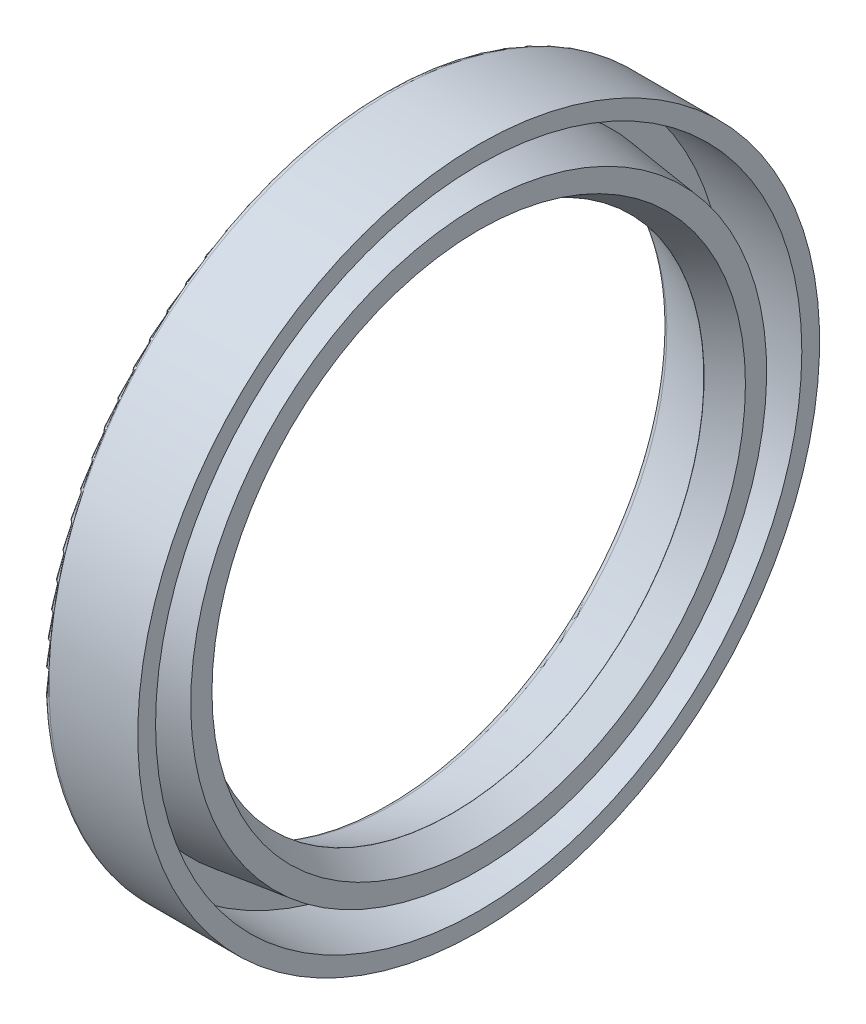
ISO-10303-21;
HEADER;
FILE_DESCRIPTION(('STEP AP214'),'2;1');
FILE_NAME('part.step','',(''),(''),'','','');
FILE_SCHEMA(('AUTOMOTIVE_DESIGN { 1 0 10303 214 1 1 1 1 }'));
ENDSEC;
DATA;
#1=APPLICATION_CONTEXT('core data for automotive mechanical design processes');
#2=APPLICATION_PROTOCOL_DEFINITION('international standard','automotive_design',2000,#1);
#3=PRODUCT_CONTEXT('',#1,'mechanical');
#4=PRODUCT('Part','Part','',(#3));
#5=PRODUCT_RELATED_PRODUCT_CATEGORY('part','',(#4));
#6=PRODUCT_DEFINITION_FORMATION('','',#4);
#7=PRODUCT_DEFINITION_CONTEXT('part definition',#1,'design');
#8=PRODUCT_DEFINITION('design','',#6,#7);
#9=PRODUCT_DEFINITION_SHAPE('','',#8);
#10=(LENGTH_UNIT() NAMED_UNIT(*) SI_UNIT(.MILLI.,.METRE.));
#11=(NAMED_UNIT(*) PLANE_ANGLE_UNIT() SI_UNIT($,.RADIAN.));
#12=(NAMED_UNIT(*) SI_UNIT($,.STERADIAN.) SOLID_ANGLE_UNIT());
#13=UNCERTAINTY_MEASURE_WITH_UNIT(LENGTH_MEASURE(1.E-05),#10,'distance_accuracy_value','');
#14=(GEOMETRIC_REPRESENTATION_CONTEXT(3) GLOBAL_UNCERTAINTY_ASSIGNED_CONTEXT((#13)) GLOBAL_UNIT_ASSIGNED_CONTEXT((#10,
#11,#12)) REPRESENTATION_CONTEXT('',''));
#15=CARTESIAN_POINT('',(0.,0.,0.));
#16=DIRECTION('',(0.,0.,1.));
#17=DIRECTION('',(1.,0.,0.));
#18=AXIS2_PLACEMENT_3D('',#15,#16,#17);
#19=CARTESIAN_POINT('',(0.9025,0.,0.));
#20=DIRECTION('',(-1.,0.,0.));
#21=DIRECTION('',(0.,-1.,0.));
#22=AXIS2_PLACEMENT_3D('',#19,#20,#21);
#23=CONICAL_SURFACE('',#22,9.71419205304634,0.124354994546765);
#24=CARTESIAN_POINT('',(-1.6975,0.,0.));
#25=DIRECTION('',(1.,0.,0.));
#26=DIRECTION('',(0.,1.,0.));
#27=AXIS2_PLACEMENT_3D('',#24,#25,#26);
#28=CIRCLE('',#27,10.0391920530463);
#29=CARTESIAN_POINT('',(-1.6975,10.0391920530463,0.));
#30=VERTEX_POINT('',#29);
#31=EDGE_CURVE('E10',#30,#30,#28,.T.);
#32=ORIENTED_EDGE('',*,*,#31,.T.);
#33=EDGE_LOOP('',(#32));
#34=FACE_BOUND('',#33,.T.);
#35=CARTESIAN_POINT('',(0.9025,0.,0.));
#36=DIRECTION('',(1.,0.,0.));
#37=DIRECTION('',(0.,1.,0.));
#38=AXIS2_PLACEMENT_3D('',#35,#36,#37);
#39=CIRCLE('',#38,9.71419205304634);
#40=CARTESIAN_POINT('',(0.9025,9.71419205304634,0.));
#41=VERTEX_POINT('',#40);
#42=EDGE_CURVE('E85',#41,#41,#39,.T.);
#43=ORIENTED_EDGE('',*,*,#42,.F.);
#44=EDGE_LOOP('',(#43));
#45=FACE_BOUND('',#44,.T.);
#46=ADVANCED_FACE('F45',(#34,#45),#23,.T.);
#47=CARTESIAN_POINT('',(-1.6975,10.9,0.));
#48=DIRECTION('',(1.,0.,0.));
#49=DIRECTION('',(0.,1.,0.));
#50=AXIS2_PLACEMENT_3D('',#47,#48,#49);
#51=PLANE('',#50);
#52=CARTESIAN_POINT('',(-1.6975,0.,0.));
#53=DIRECTION('',(1.,0.,0.));
#54=DIRECTION('',(0.,1.,0.));
#55=AXIS2_PLACEMENT_3D('',#52,#53,#54);
#56=CIRCLE('',#55,10.9);
#57=CARTESIAN_POINT('',(-1.6975,10.9,0.));
#58=VERTEX_POINT('',#57);
#59=EDGE_CURVE('E51',#58,#58,#56,.T.);
#60=ORIENTED_EDGE('',*,*,#59,.T.);
#61=EDGE_LOOP('',(#60));
#62=FACE_BOUND('',#61,.T.);
#63=ORIENTED_EDGE('',*,*,#31,.F.);
#64=EDGE_LOOP('',(#63));
#65=FACE_BOUND('',#64,.T.);
#66=ADVANCED_FACE('F93',(#62,#65),#51,.T.);
#67=CARTESIAN_POINT('',(0.,0.,0.));
#68=DIRECTION('',(1.,0.,0.));
#69=DIRECTION('',(0.,1.,0.));
#70=AXIS2_PLACEMENT_3D('',#67,#68,#69);
#71=CYLINDRICAL_SURFACE('',#70,10.9);
#72=CARTESIAN_POINT('',(0.9025,0.,0.));
#73=DIRECTION('',(1.,0.,0.));
#74=DIRECTION('',(0.,1.,0.));
#75=AXIS2_PLACEMENT_3D('',#72,#73,#74);
#76=CIRCLE('',#75,10.9);
#77=CARTESIAN_POINT('',(0.9025,10.9,0.));
#78=VERTEX_POINT('',#77);
#79=EDGE_CURVE('E55',#78,#78,#76,.T.);
#80=ORIENTED_EDGE('',*,*,#79,.T.);
#81=EDGE_LOOP('',(#80));
#82=FACE_BOUND('',#81,.T.);
#83=ORIENTED_EDGE('',*,*,#59,.F.);
#84=EDGE_LOOP('',(#83));
#85=FACE_BOUND('',#84,.T.);
#86=ADVANCED_FACE('F98',(#82,#85),#71,.F.);
#87=CARTESIAN_POINT('',(0.9025,11.5,0.));
#88=DIRECTION('',(1.,0.,0.));
#89=DIRECTION('',(0.,1.,0.));
#90=AXIS2_PLACEMENT_3D('',#87,#88,#89);
#91=PLANE('',#90);
#92=CARTESIAN_POINT('',(0.9025,0.,0.));
#93=DIRECTION('',(1.,0.,0.));
#94=DIRECTION('',(0.,1.,0.));
#95=AXIS2_PLACEMENT_3D('',#92,#93,#94);
#96=CIRCLE('',#95,11.5);
#97=CARTESIAN_POINT('',(0.9025,11.5,0.));
#98=VERTEX_POINT('',#97);
#99=EDGE_CURVE('E59',#98,#98,#96,.T.);
#100=ORIENTED_EDGE('',*,*,#99,.T.);
#101=EDGE_LOOP('',(#100));
#102=FACE_BOUND('',#101,.T.);
#103=ORIENTED_EDGE('',*,*,#79,.F.);
#104=EDGE_LOOP('',(#103));
#105=FACE_BOUND('',#104,.T.);
#106=ADVANCED_FACE('F102',(#102,#105),#91,.T.);
#107=CARTESIAN_POINT('',(0.,0.,0.));
#108=DIRECTION('',(1.,0.,0.));
#109=DIRECTION('',(0.,1.,0.));
#110=AXIS2_PLACEMENT_3D('',#107,#108,#109);
#111=CYLINDRICAL_SURFACE('',#110,11.5);
#112=CARTESIAN_POINT('',(-2.0975,0.,0.));
#113=DIRECTION('',(1.,0.,0.));
#114=DIRECTION('',(0.,1.,0.));
#115=AXIS2_PLACEMENT_3D('',#112,#113,#114);
#116=CIRCLE('',#115,11.5);
#117=CARTESIAN_POINT('',(-2.0975,11.5,0.));
#118=VERTEX_POINT('',#117);
#119=EDGE_CURVE('E64',#118,#118,#116,.T.);
#120=ORIENTED_EDGE('',*,*,#119,.T.);
#121=EDGE_LOOP('',(#120));
#122=FACE_BOUND('',#121,.T.);
#123=ORIENTED_EDGE('',*,*,#99,.F.);
#124=EDGE_LOOP('',(#123));
#125=FACE_BOUND('',#124,.T.);
#126=ADVANCED_FACE('F109',(#122,#125),#111,.T.);
#127=CARTESIAN_POINT('',(-2.0975,0.,0.));
#128=DIRECTION('',(1.,0.,0.));
#129=DIRECTION('',(0.,1.,0.));
#130=AXIS2_PLACEMENT_3D('',#127,#128,#129);
#131=TOROIDAL_SURFACE('',#130,11.3,0.2);
#132=CARTESIAN_POINT('',(-2.2975,0.,0.));
#133=DIRECTION('',(1.,0.,0.));
#134=DIRECTION('',(0.,1.,0.));
#135=AXIS2_PLACEMENT_3D('',#132,#133,#134);
#136=CIRCLE('',#135,11.3);
#137=CARTESIAN_POINT('',(-2.2975,11.3,0.));
#138=VERTEX_POINT('',#137);
#139=EDGE_CURVE('E67',#138,#138,#136,.T.);
#140=ORIENTED_EDGE('',*,*,#139,.T.);
#141=EDGE_LOOP('',(#140));
#142=FACE_BOUND('',#141,.T.);
#143=ORIENTED_EDGE('',*,*,#119,.F.);
#144=EDGE_LOOP('',(#143));
#145=FACE_BOUND('',#144,.T.);
#146=ADVANCED_FACE('F113',(#142,#145),#131,.T.);
#147=CARTESIAN_POINT('',(-2.2975,11.3,0.));
#148=DIRECTION('',(-1.,0.,0.));
#149=DIRECTION('',(0.,-1.,0.));
#150=AXIS2_PLACEMENT_3D('',#147,#148,#149);
#151=PLANE('',#150);
#152=CARTESIAN_POINT('',(-2.2975,0.,0.));
#153=DIRECTION('',(1.,0.,0.));
#154=DIRECTION('',(0.,1.,0.));
#155=AXIS2_PLACEMENT_3D('',#152,#153,#154);
#156=CIRCLE('',#155,9.68858623704572);
#157=CARTESIAN_POINT('',(-2.2975,9.68858623704572,0.));
#158=VERTEX_POINT('',#157);
#159=EDGE_CURVE('E70',#158,#158,#156,.T.);
#160=ORIENTED_EDGE('',*,*,#159,.T.);
#161=EDGE_LOOP('',(#160));
#162=FACE_BOUND('',#161,.T.);
#163=ORIENTED_EDGE('',*,*,#139,.F.);
#164=EDGE_LOOP('',(#163));
#165=FACE_BOUND('',#164,.T.);
#166=ADVANCED_FACE('F117',(#162,#165),#151,.T.);
#167=CARTESIAN_POINT('',(-1.7975,0.,0.));
#168=DIRECTION('',(1.,0.,0.));
#169=DIRECTION('',(0.,1.,0.));
#170=AXIS2_PLACEMENT_3D('',#167,#168,#169);
#171=TOROIDAL_SURFACE('',#170,9.68858623704572,0.500000000000001);
#172=CARTESIAN_POINT('',(-1.96898624966466,0.,0.));
#173=DIRECTION('',(1.,0.,0.));
#174=DIRECTION('',(0.,1.,0.));
#175=AXIS2_PLACEMENT_3D('',#172,#173,#174);
#176=CIRCLE('',#175,9.21891351463579);
#177=CARTESIAN_POINT('',(-1.96898624966466,9.21891351463579,0.));
#178=VERTEX_POINT('',#177);
#179=EDGE_CURVE('E73',#178,#178,#176,.T.);
#180=ORIENTED_EDGE('',*,*,#179,.T.);
#181=EDGE_LOOP('',(#180));
#182=FACE_BOUND('',#181,.T.);
#183=ORIENTED_EDGE('',*,*,#159,.F.);
#184=EDGE_LOOP('',(#183));
#185=FACE_BOUND('',#184,.T.);
#186=ADVANCED_FACE('F121',(#182,#185),#171,.T.);
#187=CARTESIAN_POINT('',(-1.96898624966466,0.,0.));
#188=DIRECTION('',(-1.,0.,0.));
#189=DIRECTION('',(0.,-1.,0.));
#190=AXIS2_PLACEMENT_3D('',#187,#188,#189);
#191=CONICAL_SURFACE('',#190,9.21891351463579,0.350079513655124);
#192=CARTESIAN_POINT('',(0.,0.,0.));
#193=DIRECTION('',(1.,0.,0.));
#194=DIRECTION('',(0.,1.,0.));
#195=AXIS2_PLACEMENT_3D('',#192,#193,#194);
#196=CIRCLE('',#195,8.5);
#197=CARTESIAN_POINT('',(0.,8.5,0.));
#198=VERTEX_POINT('',#197);
#199=EDGE_CURVE('E76',#198,#198,#196,.T.);
#200=ORIENTED_EDGE('',*,*,#199,.T.);
#201=EDGE_LOOP('',(#200));
#202=FACE_BOUND('',#201,.T.);
#203=ORIENTED_EDGE('',*,*,#179,.F.);
#204=EDGE_LOOP('',(#203));
#205=FACE_BOUND('',#204,.T.);
#206=ADVANCED_FACE('F125',(#202,#205),#191,.F.);
#207=CARTESIAN_POINT('',(0.,0.,0.));
#208=DIRECTION('',(1.,0.,0.));
#209=DIRECTION('',(0.,1.,0.));
#210=AXIS2_PLACEMENT_3D('',#207,#208,#209);
#211=CYLINDRICAL_SURFACE('',#210,8.5);
#212=CARTESIAN_POINT('',(0.00499999999999806,0.,0.));
#213=DIRECTION('',(1.,0.,0.));
#214=DIRECTION('',(0.,1.,0.));
#215=AXIS2_PLACEMENT_3D('',#212,#213,#214);
#216=CIRCLE('',#215,8.5);
#217=CARTESIAN_POINT('',(0.00499999999999806,8.5,0.));
#218=VERTEX_POINT('',#217);
#219=EDGE_CURVE('E79',#218,#218,#216,.T.);
#220=ORIENTED_EDGE('',*,*,#219,.T.);
#221=EDGE_LOOP('',(#220));
#222=FACE_BOUND('',#221,.T.);
#223=ORIENTED_EDGE('',*,*,#199,.F.);
#224=EDGE_LOOP('',(#223));
#225=FACE_BOUND('',#224,.T.);
#226=ADVANCED_FACE('F129',(#222,#225),#211,.F.);
#227=CARTESIAN_POINT('',(0.00499999999999806,0.,0.));
#228=DIRECTION('',(1.,0.,0.));
#229=DIRECTION('',(0.,1.,0.));
#230=AXIS2_PLACEMENT_3D('',#227,#228,#229);
#231=CONICAL_SURFACE('',#230,8.5,0.506237001118142);
#232=CARTESIAN_POINT('',(0.9025,0.,0.));
#233=DIRECTION('',(1.,0.,0.));
#234=DIRECTION('',(0.,1.,0.));
#235=AXIS2_PLACEMENT_3D('',#232,#233,#234);
#236=CIRCLE('',#235,8.99759975399604);
#237=CARTESIAN_POINT('',(0.9025,8.99759975399604,0.));
#238=VERTEX_POINT('',#237);
#239=EDGE_CURVE('E82',#238,#238,#236,.T.);
#240=ORIENTED_EDGE('',*,*,#239,.T.);
#241=EDGE_LOOP('',(#240));
#242=FACE_BOUND('',#241,.T.);
#243=ORIENTED_EDGE('',*,*,#219,.F.);
#244=EDGE_LOOP('',(#243));
#245=FACE_BOUND('',#244,.T.);
#246=ADVANCED_FACE('F133',(#242,#245),#231,.F.);
#247=CARTESIAN_POINT('',(0.9025,9.71419205304634,0.));
#248=DIRECTION('',(1.,0.,0.));
#249=DIRECTION('',(0.,1.,0.));
#250=AXIS2_PLACEMENT_3D('',#247,#248,#249);
#251=PLANE('',#250);
#252=ORIENTED_EDGE('',*,*,#42,.T.);
#253=EDGE_LOOP('',(#252));
#254=FACE_BOUND('',#253,.T.);
#255=ORIENTED_EDGE('',*,*,#239,.F.);
#256=EDGE_LOOP('',(#255));
#257=FACE_BOUND('',#256,.T.);
#258=ADVANCED_FACE('F89',(#254,#257),#251,.T.);
#259=CLOSED_SHELL('',(#46,#66,#86,#106,#126,#146,#166,#186,#206,#226,#246,#258));
#260=MANIFOLD_SOLID_BREP('B2',#259);
#261=ADVANCED_BREP_SHAPE_REPRESENTATION('',(#18,#260),#14);
#262=SHAPE_DEFINITION_REPRESENTATION(#9,#261);
ENDSEC;
END-ISO-10303-21;
